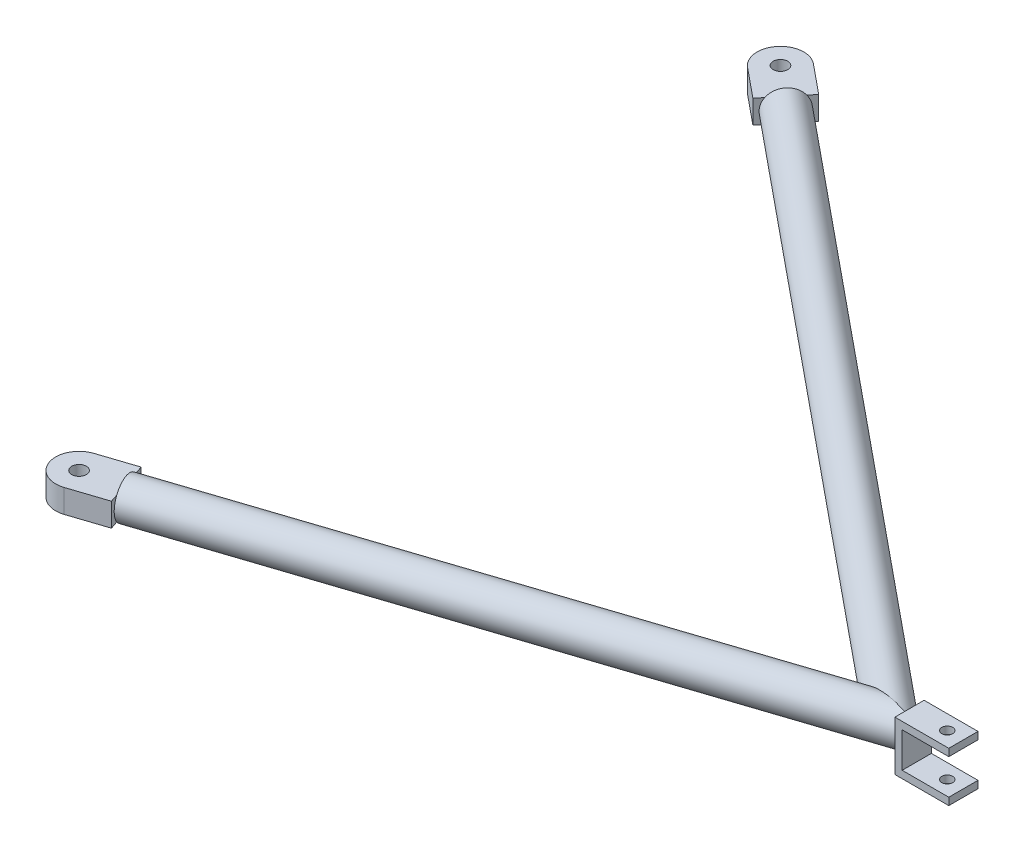
ISO-10303-21;
HEADER;
FILE_DESCRIPTION(('STEP AP214'),'2;1');
FILE_NAME('part.step','',(''),(''),'','','');
FILE_SCHEMA(('AUTOMOTIVE_DESIGN { 1 0 10303 214 1 1 1 1 }'));
ENDSEC;
DATA;
#1=APPLICATION_CONTEXT('core data for automotive mechanical design processes');
#2=APPLICATION_PROTOCOL_DEFINITION('international standard','automotive_design',2000,#1);
#3=PRODUCT_CONTEXT('',#1,'mechanical');
#4=PRODUCT('Part','Part','',(#3));
#5=PRODUCT_RELATED_PRODUCT_CATEGORY('part','',(#4));
#6=PRODUCT_DEFINITION_FORMATION('','',#4);
#7=PRODUCT_DEFINITION_CONTEXT('part definition',#1,'design');
#8=PRODUCT_DEFINITION('design','',#6,#7);
#9=PRODUCT_DEFINITION_SHAPE('','',#8);
#10=(LENGTH_UNIT() NAMED_UNIT(*) SI_UNIT(.MILLI.,.METRE.));
#11=(NAMED_UNIT(*) PLANE_ANGLE_UNIT() SI_UNIT($,.RADIAN.));
#12=(NAMED_UNIT(*) SI_UNIT($,.STERADIAN.) SOLID_ANGLE_UNIT());
#13=UNCERTAINTY_MEASURE_WITH_UNIT(LENGTH_MEASURE(1.E-05),#10,'distance_accuracy_value','');
#14=(GEOMETRIC_REPRESENTATION_CONTEXT(3) GLOBAL_UNCERTAINTY_ASSIGNED_CONTEXT((#13)) GLOBAL_UNIT_ASSIGNED_CONTEXT((#10,
#11,#12)) REPRESENTATION_CONTEXT('',''));
#15=CARTESIAN_POINT('',(0.,0.,0.));
#16=DIRECTION('',(0.,0.,1.));
#17=DIRECTION('',(1.,0.,0.));
#18=AXIS2_PLACEMENT_3D('',#15,#16,#17);
#19=CARTESIAN_POINT('',(12.8643448013669,0.,10.5323090755523));
#20=DIRECTION('',(-0.773752797618783,0.,-0.633487654320988));
#21=DIRECTION('',(-0.633487654320988,0.,0.773752797618783));
#22=AXIS2_PLACEMENT_3D('',#19,#20,#21);
#23=CYLINDRICAL_SURFACE('',#22,8.25499999999999);
#24=CARTESIAN_POINT('',(10.5039583333333,0.,8.59981113625265));
#25=DIRECTION('',(-1.,0.,0.));
#26=DIRECTION('',(0.,0.,-1.));
#27=AXIS2_PLACEMENT_3D('',#24,#25,#26);
#28=ELLIPSE('',#27,10.6687821037994,8.25499999999999);
#29=CARTESIAN_POINT('',(10.5039583333332,-6.45570290195814,1.9506643619853));
#30=VERTEX_POINT('',#29);
#31=CARTESIAN_POINT('',(10.5039583333332,6.45570290195814,1.9506643619853));
#32=VERTEX_POINT('',#31);
#33=EDGE_CURVE('E230',#30,#32,#28,.F.);
#34=ORIENTED_EDGE('',*,*,#33,.F.);
#35=CARTESIAN_POINT('',(0.,0.,0.));
#36=DIRECTION('',(0.182585791656968,0.,-0.983189925032289));
#37=DIRECTION('',(0.983189925032289,0.,0.182585791656968));
#38=AXIS2_PLACEMENT_3D('',#35,#36,#37);
#39=ELLIPSE('',#38,17.1421186326536,8.25499999999999);
#40=EDGE_CURVE('E55',#32,#30,#39,.F.);
#41=ORIENTED_EDGE('',*,*,#40,.F.);
#42=EDGE_LOOP('',(#34,#41));
#43=FACE_BOUND('',#42,.T.);
#44=CARTESIAN_POINT('',(-252.545175614795,0.,-206.764035493827));
#45=DIRECTION('',(-0.773752797618783,0.,-0.633487654320988));
#46=DIRECTION('',(-0.633487654320988,0.,0.773752797618783));
#47=AXIS2_PLACEMENT_3D('',#44,#45,#46);
#48=CIRCLE('',#47,8.25499999999999);
#49=CARTESIAN_POINT('',(-256.66716178576,5.08,-201.729370161716));
#50=VERTEX_POINT('',#49);
#51=CARTESIAN_POINT('',(-256.66716178576,-5.08,-201.729370161716));
#52=VERTEX_POINT('',#51);
#53=EDGE_CURVE('E41',#50,#52,#48,.F.);
#54=ORIENTED_EDGE('',*,*,#53,.T.);
#55=CARTESIAN_POINT('',(-252.545175614795,0.,-206.764035493827));
#56=DIRECTION('',(-0.773752797618783,0.,-0.633487654320988));
#57=DIRECTION('',(-0.633487654320988,0.,0.773752797618783));
#58=AXIS2_PLACEMENT_3D('',#55,#56,#57);
#59=CIRCLE('',#58,8.25499999999997);
#60=CARTESIAN_POINT('',(-248.423189443829,-5.08,-211.798700825939));
#61=VERTEX_POINT('',#60);
#62=EDGE_CURVE('E191',#52,#61,#59,.F.);
#63=ORIENTED_EDGE('',*,*,#62,.T.);
#64=CARTESIAN_POINT('',(-248.423189443829,5.08,-211.798700825939));
#65=VERTEX_POINT('',#64);
#66=EDGE_CURVE('E11',#61,#65,#48,.F.);
#67=ORIENTED_EDGE('',*,*,#66,.T.);
#68=CARTESIAN_POINT('',(-252.545175614795,0.,-206.764035493827));
#69=DIRECTION('',(-0.773752797618783,0.,-0.633487654320988));
#70=DIRECTION('',(-0.633487654320988,0.,0.773752797618783));
#71=AXIS2_PLACEMENT_3D('',#68,#69,#70);
#72=CIRCLE('',#71,8.25500000000001);
#73=EDGE_CURVE('E213',#65,#50,#72,.F.);
#74=ORIENTED_EDGE('',*,*,#73,.T.);
#75=EDGE_LOOP('',(#54,#63,#67,#74));
#76=FACE_BOUND('',#75,.T.);
#77=ADVANCED_FACE('F38',(#43,#76),#23,.T.);
#78=CARTESIAN_POINT('',(-265.319834303481,0.,87.5770833333333));
#79=DIRECTION('',(0.949605706168506,0.,-0.31344696969697));
#80=DIRECTION('',(-0.31344696969697,0.,-0.949605706168506));
#81=AXIS2_PLACEMENT_3D('',#78,#79,#80);
#82=CYLINDRICAL_SURFACE('',#81,8.25499999999999);
#83=CARTESIAN_POINT('',(10.5039583333332,0.,-3.46715893556594));
#84=DIRECTION('',(-1.,0.,0.));
#85=DIRECTION('',(0.,0.,-1.));
#86=AXIS2_PLACEMENT_3D('',#83,#84,#85);
#87=ELLIPSE('',#86,8.69308171420692,8.25499999999999);
#88=EDGE_CURVE('E52',#32,#30,#87,.F.);
#89=ORIENTED_EDGE('',*,*,#88,.F.);
#90=ORIENTED_EDGE('',*,*,#40,.T.);
#91=EDGE_LOOP('',(#89,#90));
#92=FACE_BOUND('',#91,.T.);
#93=CARTESIAN_POINT('',(-249.883043944005,0.,82.4816893939394));
#94=DIRECTION('',(-0.949605706168506,0.,0.313446969696969));
#95=DIRECTION('',(0.313446969696969,0.,0.949605706168506));
#96=AXIS2_PLACEMENT_3D('',#93,#94,#95);
#97=CIRCLE('',#96,8.25499999999999);
#98=CARTESIAN_POINT('',(-247.843502895953,5.08,88.6605968469856));
#99=VERTEX_POINT('',#98);
#100=CARTESIAN_POINT('',(-247.843502895953,-5.08,88.6605968469856));
#101=VERTEX_POINT('',#100);
#102=EDGE_CURVE('E218',#99,#101,#97,.F.);
#103=ORIENTED_EDGE('',*,*,#102,.T.);
#104=CARTESIAN_POINT('',(-249.883043944005,0.,82.4816893939394));
#105=DIRECTION('',(-0.949605706168506,0.,0.313446969696969));
#106=DIRECTION('',(0.313446969696969,0.,0.949605706168506));
#107=AXIS2_PLACEMENT_3D('',#104,#105,#106);
#108=CIRCLE('',#107,8.25499999999999);
#109=CARTESIAN_POINT('',(-251.922584992058,-5.08,76.3027819408932));
#110=VERTEX_POINT('',#109);
#111=EDGE_CURVE('E410',#101,#110,#108,.F.);
#112=ORIENTED_EDGE('',*,*,#111,.T.);
#113=CARTESIAN_POINT('',(-251.922584992058,5.08,76.3027819408932));
#114=VERTEX_POINT('',#113);
#115=EDGE_CURVE('E215',#110,#114,#97,.F.);
#116=ORIENTED_EDGE('',*,*,#115,.T.);
#117=CARTESIAN_POINT('',(-249.883043944005,0.,82.4816893939394));
#118=DIRECTION('',(-0.949605706168506,0.,0.313446969696969));
#119=DIRECTION('',(0.313446969696969,0.,0.949605706168506));
#120=AXIS2_PLACEMENT_3D('',#117,#118,#119);
#121=CIRCLE('',#120,8.25499999999998);
#122=EDGE_CURVE('E190',#114,#99,#121,.F.);
#123=ORIENTED_EDGE('',*,*,#122,.T.);
#124=EDGE_LOOP('',(#103,#112,#116,#123));
#125=FACE_BOUND('',#124,.T.);
#126=ADVANCED_FACE('F508',(#92,#125),#82,.T.);
#127=CARTESIAN_POINT('',(-253.067665156127,-5.08,72.8336954192674));
#128=DIRECTION('',(0.,-1.,0.));
#129=DIRECTION('',(0.,0.,-1.));
#130=AXIS2_PLACEMENT_3D('',#127,#128,#129);
#131=PLANE('',#130);
#132=CARTESIAN_POINT('',(-265.319834303481,-5.08,87.5770833333333));
#133=DIRECTION('',(0.,-1.,0.));
#134=DIRECTION('',(0.,0.,-1.));
#135=AXIS2_PLACEMENT_3D('',#132,#133,#134);
#136=CIRCLE('',#135,3.17499999999998);
#137=CARTESIAN_POINT('',(-265.319834303481,-5.08,84.4020833333334));
#138=VERTEX_POINT('',#137);
#139=EDGE_CURVE('E420',#138,#138,#136,.T.);
#140=ORIENTED_EDGE('',*,*,#139,.F.);
#141=EDGE_LOOP('',(#140));
#142=FACE_BOUND('',#141,.T.);
#143=DIRECTION('',(0.313446969696969,0.,0.949605706168506));
#144=VECTOR('',#143,1.);
#145=CARTESIAN_POINT('',(-247.843502895953,-5.08,88.6605968469856));
#146=LINE('',#145,#144);
#147=EDGE_CURVE('E406',#110,#101,#146,.T.);
#148=ORIENTED_EDGE('',*,*,#147,.T.);
#149=DIRECTION('',(0.313446969696969,0.,0.949605706168506));
#150=VECTOR('',#149,1.);
#151=CARTESIAN_POINT('',(-253.067665156127,-5.08,72.8336954192674));
#152=LINE('',#151,#150);
#153=CARTESIAN_POINT('',(-246.698422731884,-5.08,92.1296833686114));
#154=VERTEX_POINT('',#153);
#155=EDGE_CURVE('E341',#101,#154,#152,.T.);
#156=ORIENTED_EDGE('',*,*,#155,.T.);
#157=DIRECTION('',(-0.949605706168506,0.,0.31344696969697));
#158=VECTOR('',#157,1.);
#159=CARTESIAN_POINT('',(-246.698422731884,-5.08,92.1296833686114));
#160=LINE('',#159,#158);
#161=CARTESIAN_POINT('',(-262.135213091359,-5.08,97.2250773080053));
#162=VERTEX_POINT('',#161);
#163=EDGE_CURVE('E321',#154,#162,#160,.T.);
#164=ORIENTED_EDGE('',*,*,#163,.T.);
#165=CARTESIAN_POINT('',(-265.319834303481,-5.08,87.5770833333333));
#166=DIRECTION('',(0.,-1.,0.));
#167=DIRECTION('',(0.,0.,-1.));
#168=AXIS2_PLACEMENT_3D('',#165,#166,#167);
#169=CIRCLE('',#168,10.16);
#170=CARTESIAN_POINT('',(-268.504455515602,-5.08,77.9290893586613));
#171=VERTEX_POINT('',#170);
#172=EDGE_CURVE('E393',#171,#162,#169,.F.);
#173=ORIENTED_EDGE('',*,*,#172,.F.);
#174=DIRECTION('',(-0.949605706168506,0.,0.31344696969697));
#175=VECTOR('',#174,1.);
#176=CARTESIAN_POINT('',(-253.067665156127,-5.08,72.8336954192674));
#177=LINE('',#176,#175);
#178=CARTESIAN_POINT('',(-253.067665156127,-5.08,72.8336954192674));
#179=VERTEX_POINT('',#178);
#180=EDGE_CURVE('E331',#179,#171,#177,.T.);
#181=ORIENTED_EDGE('',*,*,#180,.F.);
#182=EDGE_CURVE('E327',#179,#110,#152,.T.);
#183=ORIENTED_EDGE('',*,*,#182,.T.);
#184=EDGE_LOOP('',(#148,#156,#164,#173,#181,#183));
#185=FACE_BOUND('',#184,.T.);
#186=ADVANCED_FACE('F513',(#142,#185),#131,.T.);
#187=CARTESIAN_POINT('',(-253.067665156127,5.08,72.8336954192674));
#188=DIRECTION('',(-0.31344696969697,0.,-0.949605706168506));
#189=DIRECTION('',(-0.949605706168506,0.,0.31344696969697));
#190=AXIS2_PLACEMENT_3D('',#187,#188,#189);
#191=PLANE('',#190);
#192=ORIENTED_EDGE('',*,*,#180,.T.);
#193=DIRECTION('',(0.,1.,0.));
#194=VECTOR('',#193,1.);
#195=CARTESIAN_POINT('',(-268.504455515602,-10.795,77.9290893586613));
#196=LINE('',#195,#194);
#197=CARTESIAN_POINT('',(-268.504455515602,5.08,77.9290893586613));
#198=VERTEX_POINT('',#197);
#199=EDGE_CURVE('E402',#171,#198,#196,.T.);
#200=ORIENTED_EDGE('',*,*,#199,.T.);
#201=DIRECTION('',(-0.949605706168506,0.,0.31344696969697));
#202=VECTOR('',#201,1.);
#203=CARTESIAN_POINT('',(-253.067665156127,5.08,72.8336954192674));
#204=LINE('',#203,#202);
#205=CARTESIAN_POINT('',(-253.067665156127,5.08,72.8336954192674));
#206=VERTEX_POINT('',#205);
#207=EDGE_CURVE('E326',#206,#198,#204,.T.);
#208=ORIENTED_EDGE('',*,*,#207,.F.);
#209=DIRECTION('',(0.,-1.,0.));
#210=VECTOR('',#209,1.);
#211=CARTESIAN_POINT('',(-253.067665156127,5.08,72.8336954192674));
#212=LINE('',#211,#210);
#213=EDGE_CURVE('E342',#206,#179,#212,.T.);
#214=ORIENTED_EDGE('',*,*,#213,.T.);
#215=EDGE_LOOP('',(#192,#200,#208,#214));
#216=FACE_BOUND('',#215,.T.);
#217=ADVANCED_FACE('F542',(#216),#191,.T.);
#218=CARTESIAN_POINT('',(-253.067665156127,5.08,72.8336954192674));
#219=DIRECTION('',(0.,1.,0.));
#220=DIRECTION('',(0.,0.,1.));
#221=AXIS2_PLACEMENT_3D('',#218,#219,#220);
#222=PLANE('',#221);
#223=CARTESIAN_POINT('',(-265.319834303481,5.08,87.5770833333333));
#224=DIRECTION('',(0.,1.,0.));
#225=DIRECTION('',(0.,0.,1.));
#226=AXIS2_PLACEMENT_3D('',#223,#224,#225);
#227=CIRCLE('',#226,3.17499999999998);
#228=CARTESIAN_POINT('',(-265.319834303481,5.08,90.7520833333333));
#229=VERTEX_POINT('',#228);
#230=EDGE_CURVE('E425',#229,#229,#227,.T.);
#231=ORIENTED_EDGE('',*,*,#230,.F.);
#232=EDGE_LOOP('',(#231));
#233=FACE_BOUND('',#232,.T.);
#234=DIRECTION('',(-0.313446969696969,0.,-0.949605706168506));
#235=VECTOR('',#234,1.);
#236=CARTESIAN_POINT('',(-251.922584992058,5.08,76.3027819408932));
#237=LINE('',#236,#235);
#238=EDGE_CURVE('E407',#99,#114,#237,.T.);
#239=ORIENTED_EDGE('',*,*,#238,.T.);
#240=DIRECTION('',(-0.313446969696969,0.,-0.949605706168506));
#241=VECTOR('',#240,1.);
#242=CARTESIAN_POINT('',(-253.067665156127,5.08,72.8336954192674));
#243=LINE('',#242,#241);
#244=EDGE_CURVE('E350',#114,#206,#243,.T.);
#245=ORIENTED_EDGE('',*,*,#244,.T.);
#246=ORIENTED_EDGE('',*,*,#207,.T.);
#247=CARTESIAN_POINT('',(-265.319834303481,5.08,87.5770833333333));
#248=DIRECTION('',(0.,-1.,0.));
#249=DIRECTION('',(0.,0.,-1.));
#250=AXIS2_PLACEMENT_3D('',#247,#248,#249);
#251=CIRCLE('',#250,10.16);
#252=CARTESIAN_POINT('',(-262.135213091359,5.08,97.2250773080053));
#253=VERTEX_POINT('',#252);
#254=EDGE_CURVE('E399',#253,#198,#251,.T.);
#255=ORIENTED_EDGE('',*,*,#254,.F.);
#256=DIRECTION('',(-0.949605706168506,0.,0.31344696969697));
#257=VECTOR('',#256,1.);
#258=CARTESIAN_POINT('',(-246.698422731884,5.08,92.1296833686114));
#259=LINE('',#258,#257);
#260=CARTESIAN_POINT('',(-246.698422731884,5.08,92.1296833686114));
#261=VERTEX_POINT('',#260);
#262=EDGE_CURVE('E322',#261,#253,#259,.T.);
#263=ORIENTED_EDGE('',*,*,#262,.F.);
#264=EDGE_CURVE('E346',#261,#99,#243,.T.);
#265=ORIENTED_EDGE('',*,*,#264,.T.);
#266=EDGE_LOOP('',(#239,#245,#246,#255,#263,#265));
#267=FACE_BOUND('',#266,.T.);
#268=ADVANCED_FACE('F538',(#233,#267),#222,.T.);
#269=CARTESIAN_POINT('',(-246.698422731884,5.08,92.1296833686114));
#270=DIRECTION('',(0.31344696969697,0.,0.949605706168506));
#271=DIRECTION('',(0.949605706168506,0.,-0.31344696969697));
#272=AXIS2_PLACEMENT_3D('',#269,#270,#271);
#273=PLANE('',#272);
#274=ORIENTED_EDGE('',*,*,#262,.T.);
#275=DIRECTION('',(0.,1.,0.));
#276=VECTOR('',#275,1.);
#277=CARTESIAN_POINT('',(-262.135213091359,-10.795,97.2250773080053));
#278=LINE('',#277,#276);
#279=EDGE_CURVE('E396',#162,#253,#278,.T.);
#280=ORIENTED_EDGE('',*,*,#279,.F.);
#281=ORIENTED_EDGE('',*,*,#163,.F.);
#282=DIRECTION('',(0.,1.,0.));
#283=VECTOR('',#282,1.);
#284=CARTESIAN_POINT('',(-246.698422731884,5.08,92.1296833686114));
#285=LINE('',#284,#283);
#286=EDGE_CURVE('E351',#154,#261,#285,.T.);
#287=ORIENTED_EDGE('',*,*,#286,.T.);
#288=EDGE_LOOP('',(#274,#280,#281,#287));
#289=FACE_BOUND('',#288,.T.);
#290=ADVANCED_FACE('F535',(#289),#273,.T.);
#291=CARTESIAN_POINT('',(-246.108941046893,-5.08,-214.625363917634));
#292=DIRECTION('',(0.,-1.,0.));
#293=DIRECTION('',(0.,0.,-1.));
#294=AXIS2_PLACEMENT_3D('',#291,#292,#293);
#295=PLANE('',#294);
#296=CARTESIAN_POINT('',(-265.319834303481,-5.08,-217.222916666667));
#297=DIRECTION('',(0.,-1.,0.));
#298=DIRECTION('',(0.,0.,-1.));
#299=AXIS2_PLACEMENT_3D('',#296,#297,#298);
#300=CIRCLE('',#299,3.17499999999998);
#301=CARTESIAN_POINT('',(-265.319834303481,-5.08,-220.397916666667));
#302=VERTEX_POINT('',#301);
#303=EDGE_CURVE('E429',#302,#302,#300,.T.);
#304=ORIENTED_EDGE('',*,*,#303,.F.);
#305=EDGE_LOOP('',(#304));
#306=FACE_BOUND('',#305,.T.);
#307=CARTESIAN_POINT('',(-265.319834303481,-5.08,-217.222916666667));
#308=DIRECTION('',(0.,-1.,0.));
#309=DIRECTION('',(0.,0.,-1.));
#310=AXIS2_PLACEMENT_3D('',#307,#308,#309);
#311=CIRCLE('',#310,10.1600000000001);
#312=CARTESIAN_POINT('',(-258.883599735579,-5.08,-225.084245090474));
#313=VERTEX_POINT('',#312);
#314=CARTESIAN_POINT('',(-271.756068871382,-5.08,-209.36158824286));
#315=VERTEX_POINT('',#314);
#316=EDGE_CURVE('E380',#313,#315,#311,.F.);
#317=ORIENTED_EDGE('',*,*,#316,.F.);
#318=DIRECTION('',(-0.773752797618782,0.,-0.633487654320988));
#319=VECTOR('',#318,1.);
#320=CARTESIAN_POINT('',(-246.108941046893,-5.08,-214.625363917634));
#321=LINE('',#320,#319);
#322=CARTESIAN_POINT('',(-246.108941046893,-5.08,-214.625363917634));
#323=VERTEX_POINT('',#322);
#324=EDGE_CURVE('E364',#323,#313,#321,.T.);
#325=ORIENTED_EDGE('',*,*,#324,.F.);
#326=DIRECTION('',(-0.633487654320988,0.,0.773752797618783));
#327=VECTOR('',#326,1.);
#328=CARTESIAN_POINT('',(-246.108941046893,-5.08,-214.625363917634));
#329=LINE('',#328,#327);
#330=EDGE_CURVE('E186',#323,#61,#329,.T.);
#331=ORIENTED_EDGE('',*,*,#330,.T.);
#332=DIRECTION('',(-0.633487654320988,0.,0.773752797618783));
#333=VECTOR('',#332,1.);
#334=CARTESIAN_POINT('',(-256.66716178576,-5.08,-201.729370161716));
#335=LINE('',#334,#333);
#336=EDGE_CURVE('E178',#61,#52,#335,.T.);
#337=ORIENTED_EDGE('',*,*,#336,.T.);
#338=CARTESIAN_POINT('',(-258.981410182696,-5.08,-198.90270707002));
#339=VERTEX_POINT('',#338);
#340=EDGE_CURVE('E183',#52,#339,#329,.T.);
#341=ORIENTED_EDGE('',*,*,#340,.T.);
#342=DIRECTION('',(-0.773752797618782,0.,-0.633487654320988));
#343=VECTOR('',#342,1.);
#344=CARTESIAN_POINT('',(-258.981410182696,-5.08,-198.90270707002));
#345=LINE('',#344,#343);
#346=EDGE_CURVE('E355',#339,#315,#345,.T.);
#347=ORIENTED_EDGE('',*,*,#346,.T.);
#348=EDGE_LOOP('',(#317,#325,#331,#337,#341,#347));
#349=FACE_BOUND('',#348,.T.);
#350=ADVANCED_FACE('F180',(#306,#349),#295,.T.);
#351=CARTESIAN_POINT('',(-246.108941046893,5.08,-214.625363917634));
#352=DIRECTION('',(0.633487654320988,0.,-0.773752797618782));
#353=DIRECTION('',(-0.773752797618782,0.,-0.633487654320988));
#354=AXIS2_PLACEMENT_3D('',#351,#352,#353);
#355=PLANE('',#354);
#356=ORIENTED_EDGE('',*,*,#324,.T.);
#357=DIRECTION('',(0.,1.,0.));
#358=VECTOR('',#357,1.);
#359=CARTESIAN_POINT('',(-258.883599735579,-10.795,-225.084245090474));
#360=LINE('',#359,#358);
#361=CARTESIAN_POINT('',(-258.883599735579,5.08,-225.084245090474));
#362=VERTEX_POINT('',#361);
#363=EDGE_CURVE('E389',#313,#362,#360,.T.);
#364=ORIENTED_EDGE('',*,*,#363,.T.);
#365=DIRECTION('',(-0.773752797618782,0.,-0.633487654320988));
#366=VECTOR('',#365,1.);
#367=CARTESIAN_POINT('',(-246.108941046893,5.08,-214.625363917634));
#368=LINE('',#367,#366);
#369=CARTESIAN_POINT('',(-246.108941046893,5.08,-214.625363917634));
#370=VERTEX_POINT('',#369);
#371=EDGE_CURVE('E360',#370,#362,#368,.T.);
#372=ORIENTED_EDGE('',*,*,#371,.F.);
#373=DIRECTION('',(0.,-1.,0.));
#374=VECTOR('',#373,1.);
#375=CARTESIAN_POINT('',(-246.108941046893,5.08,-214.625363917634));
#376=LINE('',#375,#374);
#377=EDGE_CURVE('E209',#370,#323,#376,.T.);
#378=ORIENTED_EDGE('',*,*,#377,.T.);
#379=EDGE_LOOP('',(#356,#364,#372,#378));
#380=FACE_BOUND('',#379,.T.);
#381=ADVANCED_FACE('F557',(#380),#355,.T.);
#382=CARTESIAN_POINT('',(-246.108941046893,5.08,-214.625363917634));
#383=DIRECTION('',(0.,1.,0.));
#384=DIRECTION('',(0.,0.,1.));
#385=AXIS2_PLACEMENT_3D('',#382,#383,#384);
#386=PLANE('',#385);
#387=CARTESIAN_POINT('',(-265.319834303481,5.08,-217.222916666667));
#388=DIRECTION('',(0.,1.,0.));
#389=DIRECTION('',(0.,0.,1.));
#390=AXIS2_PLACEMENT_3D('',#387,#388,#389);
#391=CIRCLE('',#390,3.17499999999998);
#392=CARTESIAN_POINT('',(-265.319834303481,5.08,-214.047916666667));
#393=VERTEX_POINT('',#392);
#394=EDGE_CURVE('E433',#393,#393,#391,.T.);
#395=ORIENTED_EDGE('',*,*,#394,.F.);
#396=EDGE_LOOP('',(#395));
#397=FACE_BOUND('',#396,.T.);
#398=ORIENTED_EDGE('',*,*,#371,.T.);
#399=CARTESIAN_POINT('',(-265.319834303481,5.08,-217.222916666667));
#400=DIRECTION('',(0.,-1.,0.));
#401=DIRECTION('',(0.,0.,1.));
#402=AXIS2_PLACEMENT_3D('',#399,#400,#401);
#403=CIRCLE('',#402,10.1600000000001);
#404=CARTESIAN_POINT('',(-271.756068871382,5.08,-209.36158824286));
#405=VERTEX_POINT('',#404);
#406=EDGE_CURVE('E386',#405,#362,#403,.T.);
#407=ORIENTED_EDGE('',*,*,#406,.F.);
#408=DIRECTION('',(-0.773752797618782,0.,-0.633487654320988));
#409=VECTOR('',#408,1.);
#410=CARTESIAN_POINT('',(-258.981410182696,5.08,-198.90270707002));
#411=LINE('',#410,#409);
#412=CARTESIAN_POINT('',(-258.981410182696,5.08,-198.90270707002));
#413=VERTEX_POINT('',#412);
#414=EDGE_CURVE('E356',#413,#405,#411,.T.);
#415=ORIENTED_EDGE('',*,*,#414,.F.);
#416=DIRECTION('',(0.633487654320988,0.,-0.773752797618783));
#417=VECTOR('',#416,1.);
#418=CARTESIAN_POINT('',(-246.108941046893,5.08,-214.625363917634));
#419=LINE('',#418,#417);
#420=EDGE_CURVE('E374',#413,#50,#419,.T.);
#421=ORIENTED_EDGE('',*,*,#420,.T.);
#422=DIRECTION('',(0.633487654320988,0.,-0.773752797618783));
#423=VECTOR('',#422,1.);
#424=CARTESIAN_POINT('',(-248.423189443829,5.08,-211.798700825939));
#425=LINE('',#424,#423);
#426=EDGE_CURVE('E198',#50,#65,#425,.T.);
#427=ORIENTED_EDGE('',*,*,#426,.T.);
#428=EDGE_CURVE('E377',#65,#370,#419,.T.);
#429=ORIENTED_EDGE('',*,*,#428,.T.);
#430=EDGE_LOOP('',(#398,#407,#415,#421,#427,#429));
#431=FACE_BOUND('',#430,.T.);
#432=ADVANCED_FACE('F504',(#397,#431),#386,.T.);
#433=CARTESIAN_POINT('',(-258.981410182696,5.08,-198.90270707002));
#434=DIRECTION('',(-0.633487654320988,0.,0.773752797618782));
#435=DIRECTION('',(0.773752797618782,0.,0.633487654320988));
#436=AXIS2_PLACEMENT_3D('',#433,#434,#435);
#437=PLANE('',#436);
#438=ORIENTED_EDGE('',*,*,#414,.T.);
#439=DIRECTION('',(0.,1.,0.));
#440=VECTOR('',#439,1.);
#441=CARTESIAN_POINT('',(-271.756068871382,-10.795,-209.36158824286));
#442=LINE('',#441,#440);
#443=EDGE_CURVE('E383',#315,#405,#442,.T.);
#444=ORIENTED_EDGE('',*,*,#443,.F.);
#445=ORIENTED_EDGE('',*,*,#346,.F.);
#446=DIRECTION('',(0.,1.,0.));
#447=VECTOR('',#446,1.);
#448=CARTESIAN_POINT('',(-258.981410182696,5.08,-198.90270707002));
#449=LINE('',#448,#447);
#450=EDGE_CURVE('E207',#339,#413,#449,.T.);
#451=ORIENTED_EDGE('',*,*,#450,.T.);
#452=EDGE_LOOP('',(#438,#444,#445,#451));
#453=FACE_BOUND('',#452,.T.);
#454=ADVANCED_FACE('F496',(#453),#437,.T.);
#455=CARTESIAN_POINT('',(33.9317533676103,7.62,-3.81));
#456=DIRECTION('',(1.,0.,0.));
#457=DIRECTION('',(0.,0.,-1.));
#458=AXIS2_PLACEMENT_3D('',#455,#456,#457);
#459=PLANE('',#458);
#460=DIRECTION('',(0.,0.,1.));
#461=VECTOR('',#460,1.);
#462=CARTESIAN_POINT('',(33.9317533676103,10.795,-3.81));
#463=LINE('',#462,#461);
#464=CARTESIAN_POINT('',(33.9317533676103,10.795,-3.81));
#465=VERTEX_POINT('',#464);
#466=CARTESIAN_POINT('',(33.9317533676103,10.795,8.89));
#467=VERTEX_POINT('',#466);
#468=EDGE_CURVE('E235',#465,#467,#463,.T.);
#469=ORIENTED_EDGE('',*,*,#468,.T.);
#470=DIRECTION('',(0.,1.,0.));
#471=VECTOR('',#470,1.);
#472=CARTESIAN_POINT('',(33.9317533676103,7.62,8.89));
#473=LINE('',#472,#471);
#474=CARTESIAN_POINT('',(33.9317533676103,7.62,8.89));
#475=VERTEX_POINT('',#474);
#476=EDGE_CURVE('E317',#475,#467,#473,.T.);
#477=ORIENTED_EDGE('',*,*,#476,.F.);
#478=DIRECTION('',(0.,0.,1.));
#479=VECTOR('',#478,1.);
#480=CARTESIAN_POINT('',(33.9317533676103,7.62,-3.81));
#481=LINE('',#480,#479);
#482=CARTESIAN_POINT('',(33.9317533676103,7.62,-3.81));
#483=VERTEX_POINT('',#482);
#484=EDGE_CURVE('E234',#483,#475,#481,.T.);
#485=ORIENTED_EDGE('',*,*,#484,.F.);
#486=DIRECTION('',(0.,1.,0.));
#487=VECTOR('',#486,1.);
#488=CARTESIAN_POINT('',(33.9317533676103,7.62,-3.81));
#489=LINE('',#488,#487);
#490=EDGE_CURVE('E286',#483,#465,#489,.T.);
#491=ORIENTED_EDGE('',*,*,#490,.T.);
#492=EDGE_LOOP('',(#469,#477,#485,#491));
#493=FACE_BOUND('',#492,.T.);
#494=ADVANCED_FACE('F494',(#493),#459,.T.);
#495=CARTESIAN_POINT('',(13.6789583333333,7.62,-3.81));
#496=DIRECTION('',(0.,-1.,0.));
#497=DIRECTION('',(1.,0.,0.));
#498=AXIS2_PLACEMENT_3D('',#495,#496,#497);
#499=PLANE('',#498);
#500=CARTESIAN_POINT('',(26.9334887853007,7.62,2.54));
#501=DIRECTION('',(0.,-1.,0.));
#502=DIRECTION('',(1.,0.,0.));
#503=AXIS2_PLACEMENT_3D('',#500,#501,#502);
#504=CIRCLE('',#503,2.38124999999999);
#505=CARTESIAN_POINT('',(29.3147387853007,7.62,2.54));
#506=VERTEX_POINT('',#505);
#507=EDGE_CURVE('E437',#506,#506,#504,.T.);
#508=ORIENTED_EDGE('',*,*,#507,.F.);
#509=EDGE_LOOP('',(#508));
#510=FACE_BOUND('',#509,.T.);
#511=ORIENTED_EDGE('',*,*,#484,.T.);
#512=DIRECTION('',(1.,0.,0.));
#513=VECTOR('',#512,1.);
#514=CARTESIAN_POINT('',(13.6789583333333,7.62,8.89));
#515=LINE('',#514,#513);
#516=CARTESIAN_POINT('',(13.6789583333333,7.62,8.89));
#517=VERTEX_POINT('',#516);
#518=EDGE_CURVE('E290',#517,#475,#515,.T.);
#519=ORIENTED_EDGE('',*,*,#518,.F.);
#520=DIRECTION('',(0.,0.,1.));
#521=VECTOR('',#520,1.);
#522=CARTESIAN_POINT('',(13.6789583333333,7.62,-3.81));
#523=LINE('',#522,#521);
#524=CARTESIAN_POINT('',(13.6789583333333,7.62,-3.81));
#525=VERTEX_POINT('',#524);
#526=EDGE_CURVE('E254',#525,#517,#523,.T.);
#527=ORIENTED_EDGE('',*,*,#526,.F.);
#528=DIRECTION('',(1.,0.,0.));
#529=VECTOR('',#528,1.);
#530=CARTESIAN_POINT('',(13.6789583333333,7.62,-3.81));
#531=LINE('',#530,#529);
#532=EDGE_CURVE('E239',#525,#483,#531,.T.);
#533=ORIENTED_EDGE('',*,*,#532,.T.);
#534=EDGE_LOOP('',(#511,#519,#527,#533));
#535=FACE_BOUND('',#534,.T.);
#536=ADVANCED_FACE('F491',(#510,#535),#499,.T.);
#537=CARTESIAN_POINT('',(13.6789583333333,-7.62,-3.81));
#538=DIRECTION('',(1.,0.,0.));
#539=DIRECTION('',(0.,1.,0.));
#540=AXIS2_PLACEMENT_3D('',#537,#538,#539);
#541=PLANE('',#540);
#542=ORIENTED_EDGE('',*,*,#526,.T.);
#543=DIRECTION('',(0.,1.,0.));
#544=VECTOR('',#543,1.);
#545=CARTESIAN_POINT('',(13.6789583333333,-7.62,8.89));
#546=LINE('',#545,#544);
#547=CARTESIAN_POINT('',(13.6789583333333,-7.62,8.89));
#548=VERTEX_POINT('',#547);
#549=EDGE_CURVE('E294',#548,#517,#546,.T.);
#550=ORIENTED_EDGE('',*,*,#549,.F.);
#551=DIRECTION('',(0.,0.,1.));
#552=VECTOR('',#551,1.);
#553=CARTESIAN_POINT('',(13.6789583333333,-7.62,-3.81));
#554=LINE('',#553,#552);
#555=CARTESIAN_POINT('',(13.6789583333333,-7.62,-3.81));
#556=VERTEX_POINT('',#555);
#557=EDGE_CURVE('E251',#556,#548,#554,.T.);
#558=ORIENTED_EDGE('',*,*,#557,.F.);
#559=DIRECTION('',(0.,1.,0.));
#560=VECTOR('',#559,1.);
#561=CARTESIAN_POINT('',(13.6789583333333,-7.62,-3.81));
#562=LINE('',#561,#560);
#563=EDGE_CURVE('E263',#556,#525,#562,.T.);
#564=ORIENTED_EDGE('',*,*,#563,.T.);
#565=EDGE_LOOP('',(#542,#550,#558,#564));
#566=FACE_BOUND('',#565,.T.);
#567=ADVANCED_FACE('F487',(#566),#541,.T.);
#568=CARTESIAN_POINT('',(33.9317533676103,-7.62,-3.81));
#569=DIRECTION('',(0.,1.,0.));
#570=DIRECTION('',(-1.,0.,0.));
#571=AXIS2_PLACEMENT_3D('',#568,#569,#570);
#572=PLANE('',#571);
#573=CARTESIAN_POINT('',(26.9334887853007,-7.62,2.54));
#574=DIRECTION('',(0.,1.,0.));
#575=DIRECTION('',(-1.,0.,0.));
#576=AXIS2_PLACEMENT_3D('',#573,#574,#575);
#577=CIRCLE('',#576,2.38124999999999);
#578=CARTESIAN_POINT('',(24.5522387853007,-7.62,2.54));
#579=VERTEX_POINT('',#578);
#580=EDGE_CURVE('E441',#579,#579,#577,.T.);
#581=ORIENTED_EDGE('',*,*,#580,.F.);
#582=EDGE_LOOP('',(#581));
#583=FACE_BOUND('',#582,.T.);
#584=ORIENTED_EDGE('',*,*,#557,.T.);
#585=DIRECTION('',(-1.,0.,0.));
#586=VECTOR('',#585,1.);
#587=CARTESIAN_POINT('',(33.9317533676103,-7.62,8.89));
#588=LINE('',#587,#586);
#589=CARTESIAN_POINT('',(33.9317533676103,-7.62,8.89));
#590=VERTEX_POINT('',#589);
#591=EDGE_CURVE('E297',#590,#548,#588,.T.);
#592=ORIENTED_EDGE('',*,*,#591,.F.);
#593=DIRECTION('',(0.,0.,1.));
#594=VECTOR('',#593,1.);
#595=CARTESIAN_POINT('',(33.9317533676103,-7.62,-3.81));
#596=LINE('',#595,#594);
#597=CARTESIAN_POINT('',(33.9317533676103,-7.62,-3.81));
#598=VERTEX_POINT('',#597);
#599=EDGE_CURVE('E248',#598,#590,#596,.T.);
#600=ORIENTED_EDGE('',*,*,#599,.F.);
#601=DIRECTION('',(-1.,0.,0.));
#602=VECTOR('',#601,1.);
#603=CARTESIAN_POINT('',(33.9317533676103,-7.62,-3.81));
#604=LINE('',#603,#602);
#605=EDGE_CURVE('E266',#598,#556,#604,.T.);
#606=ORIENTED_EDGE('',*,*,#605,.T.);
#607=EDGE_LOOP('',(#584,#592,#600,#606));
#608=FACE_BOUND('',#607,.T.);
#609=ADVANCED_FACE('F485',(#583,#608),#572,.T.);
#610=CARTESIAN_POINT('',(33.9317533676103,-10.795,-3.81));
#611=DIRECTION('',(1.,0.,0.));
#612=DIRECTION('',(0.,0.,-1.));
#613=AXIS2_PLACEMENT_3D('',#610,#611,#612);
#614=PLANE('',#613);
#615=ORIENTED_EDGE('',*,*,#599,.T.);
#616=DIRECTION('',(0.,1.,0.));
#617=VECTOR('',#616,1.);
#618=CARTESIAN_POINT('',(33.9317533676103,-10.795,8.89));
#619=LINE('',#618,#617);
#620=CARTESIAN_POINT('',(33.9317533676103,-10.795,8.89));
#621=VERTEX_POINT('',#620);
#622=EDGE_CURVE('E301',#621,#590,#619,.T.);
#623=ORIENTED_EDGE('',*,*,#622,.F.);
#624=DIRECTION('',(0.,0.,1.));
#625=VECTOR('',#624,1.);
#626=CARTESIAN_POINT('',(33.9317533676103,-10.795,-3.81));
#627=LINE('',#626,#625);
#628=CARTESIAN_POINT('',(33.9317533676103,-10.795,-3.81));
#629=VERTEX_POINT('',#628);
#630=EDGE_CURVE('E245',#629,#621,#627,.T.);
#631=ORIENTED_EDGE('',*,*,#630,.F.);
#632=DIRECTION('',(0.,1.,0.));
#633=VECTOR('',#632,1.);
#634=CARTESIAN_POINT('',(33.9317533676103,-10.795,-3.81));
#635=LINE('',#634,#633);
#636=EDGE_CURVE('E270',#629,#598,#635,.T.);
#637=ORIENTED_EDGE('',*,*,#636,.T.);
#638=EDGE_LOOP('',(#615,#623,#631,#637));
#639=FACE_BOUND('',#638,.T.);
#640=ADVANCED_FACE('F480',(#639),#614,.T.);
#641=CARTESIAN_POINT('',(10.5039583333333,-10.795,-3.81));
#642=DIRECTION('',(0.,-1.,0.));
#643=DIRECTION('',(0.,0.,-1.));
#644=AXIS2_PLACEMENT_3D('',#641,#642,#643);
#645=PLANE('',#644);
#646=CARTESIAN_POINT('',(26.9334887853007,-10.795,2.54));
#647=DIRECTION('',(0.,1.,0.));
#648=DIRECTION('',(0.,0.,1.));
#649=AXIS2_PLACEMENT_3D('',#646,#647,#648);
#650=CIRCLE('',#649,2.38124999999998);
#651=CARTESIAN_POINT('',(26.9334887853007,-10.795,4.92124999999998));
#652=VERTEX_POINT('',#651);
#653=EDGE_CURVE('E445',#652,#652,#650,.T.);
#654=ORIENTED_EDGE('',*,*,#653,.T.);
#655=EDGE_LOOP('',(#654));
#656=FACE_BOUND('',#655,.T.);
#657=ORIENTED_EDGE('',*,*,#630,.T.);
#658=DIRECTION('',(1.,0.,0.));
#659=VECTOR('',#658,1.);
#660=CARTESIAN_POINT('',(10.5039583333333,-10.795,8.89));
#661=LINE('',#660,#659);
#662=CARTESIAN_POINT('',(10.5039583333333,-10.795,8.89));
#663=VERTEX_POINT('',#662);
#664=EDGE_CURVE('E305',#663,#621,#661,.T.);
#665=ORIENTED_EDGE('',*,*,#664,.F.);
#666=DIRECTION('',(0.,0.,1.));
#667=VECTOR('',#666,1.);
#668=CARTESIAN_POINT('',(10.5039583333333,-10.795,-3.81));
#669=LINE('',#668,#667);
#670=CARTESIAN_POINT('',(10.5039583333333,-10.795,-3.81));
#671=VERTEX_POINT('',#670);
#672=EDGE_CURVE('E242',#671,#663,#669,.T.);
#673=ORIENTED_EDGE('',*,*,#672,.F.);
#674=DIRECTION('',(1.,0.,0.));
#675=VECTOR('',#674,1.);
#676=CARTESIAN_POINT('',(10.5039583333333,-10.795,-3.81));
#677=LINE('',#676,#675);
#678=EDGE_CURVE('E274',#671,#629,#677,.T.);
#679=ORIENTED_EDGE('',*,*,#678,.T.);
#680=EDGE_LOOP('',(#657,#665,#673,#679));
#681=FACE_BOUND('',#680,.T.);
#682=ADVANCED_FACE('F473',(#656,#681),#645,.T.);
#683=CARTESIAN_POINT('',(10.5039583333333,10.795,-3.81));
#684=DIRECTION('',(-1.,0.,0.));
#685=DIRECTION('',(0.,-1.,0.));
#686=AXIS2_PLACEMENT_3D('',#683,#684,#685);
#687=PLANE('',#686);
#688=ORIENTED_EDGE('',*,*,#88,.T.);
#689=ORIENTED_EDGE('',*,*,#33,.T.);
#690=EDGE_LOOP('',(#688,#689));
#691=FACE_BOUND('',#690,.T.);
#692=ORIENTED_EDGE('',*,*,#672,.T.);
#693=DIRECTION('',(0.,-1.,0.));
#694=VECTOR('',#693,1.);
#695=CARTESIAN_POINT('',(10.5039583333333,10.795,8.89));
#696=LINE('',#695,#694);
#697=CARTESIAN_POINT('',(10.5039583333333,10.795,8.89));
#698=VERTEX_POINT('',#697);
#699=EDGE_CURVE('E309',#698,#663,#696,.T.);
#700=ORIENTED_EDGE('',*,*,#699,.F.);
#701=DIRECTION('',(0.,0.,1.));
#702=VECTOR('',#701,1.);
#703=CARTESIAN_POINT('',(10.5039583333333,10.795,-3.81));
#704=LINE('',#703,#702);
#705=CARTESIAN_POINT('',(10.5039583333333,10.795,-3.81));
#706=VERTEX_POINT('',#705);
#707=EDGE_CURVE('E238',#706,#698,#704,.T.);
#708=ORIENTED_EDGE('',*,*,#707,.F.);
#709=DIRECTION('',(0.,-1.,0.));
#710=VECTOR('',#709,1.);
#711=CARTESIAN_POINT('',(10.5039583333333,10.795,-3.81));
#712=LINE('',#711,#710);
#713=EDGE_CURVE('E278',#706,#671,#712,.T.);
#714=ORIENTED_EDGE('',*,*,#713,.T.);
#715=EDGE_LOOP('',(#692,#700,#708,#714));
#716=FACE_BOUND('',#715,.T.);
#717=ADVANCED_FACE('F460',(#691,#716),#687,.T.);
#718=CARTESIAN_POINT('',(33.9317533676103,10.795,-3.81));
#719=DIRECTION('',(0.,1.,0.));
#720=DIRECTION('',(-1.,0.,0.));
#721=AXIS2_PLACEMENT_3D('',#718,#719,#720);
#722=PLANE('',#721);
#723=CARTESIAN_POINT('',(26.9334887853007,10.795,2.54));
#724=DIRECTION('',(0.,1.,0.));
#725=DIRECTION('',(0.,0.,1.));
#726=AXIS2_PLACEMENT_3D('',#723,#724,#725);
#727=CIRCLE('',#726,2.38124999999999);
#728=CARTESIAN_POINT('',(26.9334887853007,10.795,4.92124999999999));
#729=VERTEX_POINT('',#728);
#730=EDGE_CURVE('E449',#729,#729,#727,.T.);
#731=ORIENTED_EDGE('',*,*,#730,.F.);
#732=EDGE_LOOP('',(#731));
#733=FACE_BOUND('',#732,.T.);
#734=ORIENTED_EDGE('',*,*,#707,.T.);
#735=DIRECTION('',(-1.,0.,0.));
#736=VECTOR('',#735,1.);
#737=CARTESIAN_POINT('',(33.9317533676103,10.795,8.89));
#738=LINE('',#737,#736);
#739=EDGE_CURVE('E313',#467,#698,#738,.T.);
#740=ORIENTED_EDGE('',*,*,#739,.F.);
#741=ORIENTED_EDGE('',*,*,#468,.F.);
#742=DIRECTION('',(-1.,0.,0.));
#743=VECTOR('',#742,1.);
#744=CARTESIAN_POINT('',(33.9317533676103,10.795,-3.81));
#745=LINE('',#744,#743);
#746=EDGE_CURVE('E282',#465,#706,#745,.T.);
#747=ORIENTED_EDGE('',*,*,#746,.T.);
#748=EDGE_LOOP('',(#734,#740,#741,#747));
#749=FACE_BOUND('',#748,.T.);
#750=ADVANCED_FACE('F456',(#733,#749),#722,.T.);
#751=CARTESIAN_POINT('',(0.,0.,-3.81));
#752=DIRECTION('',(0.,0.,1.));
#753=DIRECTION('',(1.,0.,0.));
#754=AXIS2_PLACEMENT_3D('',#751,#752,#753);
#755=PLANE('',#754);
#756=ORIENTED_EDGE('',*,*,#490,.F.);
#757=ORIENTED_EDGE('',*,*,#532,.F.);
#758=ORIENTED_EDGE('',*,*,#563,.F.);
#759=ORIENTED_EDGE('',*,*,#605,.F.);
#760=ORIENTED_EDGE('',*,*,#636,.F.);
#761=ORIENTED_EDGE('',*,*,#678,.F.);
#762=ORIENTED_EDGE('',*,*,#713,.F.);
#763=ORIENTED_EDGE('',*,*,#746,.F.);
#764=EDGE_LOOP('',(#756,#757,#758,#759,#760,#761,#762,#763));
#765=FACE_BOUND('',#764,.T.);
#766=ADVANCED_FACE('F459',(#765),#755,.F.);
#767=CARTESIAN_POINT('',(0.,0.,8.89));
#768=DIRECTION('',(0.,0.,1.));
#769=DIRECTION('',(1.,0.,0.));
#770=AXIS2_PLACEMENT_3D('',#767,#768,#769);
#771=PLANE('',#770);
#772=ORIENTED_EDGE('',*,*,#476,.T.);
#773=ORIENTED_EDGE('',*,*,#739,.T.);
#774=ORIENTED_EDGE('',*,*,#699,.T.);
#775=ORIENTED_EDGE('',*,*,#664,.T.);
#776=ORIENTED_EDGE('',*,*,#622,.T.);
#777=ORIENTED_EDGE('',*,*,#591,.T.);
#778=ORIENTED_EDGE('',*,*,#549,.T.);
#779=ORIENTED_EDGE('',*,*,#518,.T.);
#780=EDGE_LOOP('',(#772,#773,#774,#775,#776,#777,#778,#779));
#781=FACE_BOUND('',#780,.T.);
#782=ADVANCED_FACE('F468',(#781),#771,.T.);
#783=CARTESIAN_POINT('',(-249.883043944005,0.,82.4816893939393));
#784=DIRECTION('',(-0.949605706168506,0.,0.313446969696969));
#785=DIRECTION('',(0.313446969696969,0.,0.949605706168506));
#786=AXIS2_PLACEMENT_3D('',#783,#784,#785);
#787=PLANE('',#786);
#788=ORIENTED_EDGE('',*,*,#115,.F.);
#789=ORIENTED_EDGE('',*,*,#182,.F.);
#790=ORIENTED_EDGE('',*,*,#213,.F.);
#791=ORIENTED_EDGE('',*,*,#244,.F.);
#792=EDGE_LOOP('',(#788,#789,#790,#791));
#793=FACE_BOUND('',#792,.T.);
#794=ADVANCED_FACE('F534',(#793),#787,.F.);
#795=ORIENTED_EDGE('',*,*,#102,.F.);
#796=ORIENTED_EDGE('',*,*,#264,.F.);
#797=ORIENTED_EDGE('',*,*,#286,.F.);
#798=ORIENTED_EDGE('',*,*,#155,.F.);
#799=EDGE_LOOP('',(#795,#796,#797,#798));
#800=FACE_BOUND('',#799,.T.);
#801=ADVANCED_FACE('F550',(#800),#787,.F.);
#802=CARTESIAN_POINT('',(-252.545175614795,0.,-206.764035493827));
#803=DIRECTION('',(-0.773752797618783,0.,-0.633487654320988));
#804=DIRECTION('',(-0.633487654320988,0.,0.773752797618783));
#805=AXIS2_PLACEMENT_3D('',#802,#803,#804);
#806=PLANE('',#805);
#807=ORIENTED_EDGE('',*,*,#66,.F.);
#808=ORIENTED_EDGE('',*,*,#330,.F.);
#809=ORIENTED_EDGE('',*,*,#377,.F.);
#810=ORIENTED_EDGE('',*,*,#428,.F.);
#811=EDGE_LOOP('',(#807,#808,#809,#810));
#812=FACE_BOUND('',#811,.T.);
#813=ADVANCED_FACE('F552',(#812),#806,.F.);
#814=ORIENTED_EDGE('',*,*,#53,.F.);
#815=ORIENTED_EDGE('',*,*,#420,.F.);
#816=ORIENTED_EDGE('',*,*,#450,.F.);
#817=ORIENTED_EDGE('',*,*,#340,.F.);
#818=EDGE_LOOP('',(#814,#815,#816,#817));
#819=FACE_BOUND('',#818,.T.);
#820=ADVANCED_FACE('F203',(#819),#806,.F.);
#821=CARTESIAN_POINT('',(-265.319834303481,-10.795,-217.222916666667));
#822=DIRECTION('',(0.,1.,0.));
#823=DIRECTION('',(0.,0.,1.));
#824=AXIS2_PLACEMENT_3D('',#821,#822,#823);
#825=CYLINDRICAL_SURFACE('',#824,10.1600000000001);
#826=ORIENTED_EDGE('',*,*,#316,.T.);
#827=ORIENTED_EDGE('',*,*,#443,.T.);
#828=ORIENTED_EDGE('',*,*,#406,.T.);
#829=ORIENTED_EDGE('',*,*,#363,.F.);
#830=EDGE_LOOP('',(#826,#827,#828,#829));
#831=FACE_BOUND('',#830,.T.);
#832=ADVANCED_FACE('F567',(#831),#825,.T.);
#833=CARTESIAN_POINT('',(-265.319834303481,-10.795,87.5770833333333));
#834=DIRECTION('',(0.,1.,0.));
#835=DIRECTION('',(0.,0.,1.));
#836=AXIS2_PLACEMENT_3D('',#833,#834,#835);
#837=CYLINDRICAL_SURFACE('',#836,10.16);
#838=ORIENTED_EDGE('',*,*,#172,.T.);
#839=ORIENTED_EDGE('',*,*,#279,.T.);
#840=ORIENTED_EDGE('',*,*,#254,.T.);
#841=ORIENTED_EDGE('',*,*,#199,.F.);
#842=EDGE_LOOP('',(#838,#839,#840,#841));
#843=FACE_BOUND('',#842,.T.);
#844=ADVANCED_FACE('F570',(#843),#837,.T.);
#845=CARTESIAN_POINT('',(-249.883043944005,0.,82.4816893939393));
#846=DIRECTION('',(-0.949605706168506,0.,0.313446969696969));
#847=DIRECTION('',(0.313446969696969,0.,0.949605706168506));
#848=AXIS2_PLACEMENT_3D('',#845,#846,#847);
#849=PLANE('',#848);
#850=ORIENTED_EDGE('',*,*,#122,.F.);
#851=ORIENTED_EDGE('',*,*,#238,.F.);
#852=EDGE_LOOP('',(#850,#851));
#853=FACE_BOUND('',#852,.T.);
#854=ADVANCED_FACE('F574',(#853),#849,.T.);
#855=CARTESIAN_POINT('',(-249.883043944005,0.,82.4816893939393));
#856=DIRECTION('',(-0.949605706168506,0.,0.313446969696969));
#857=DIRECTION('',(0.313446969696969,0.,0.949605706168506));
#858=AXIS2_PLACEMENT_3D('',#855,#856,#857);
#859=PLANE('',#858);
#860=ORIENTED_EDGE('',*,*,#111,.F.);
#861=ORIENTED_EDGE('',*,*,#147,.F.);
#862=EDGE_LOOP('',(#860,#861));
#863=FACE_BOUND('',#862,.T.);
#864=ADVANCED_FACE('F578',(#863),#859,.T.);
#865=CARTESIAN_POINT('',(-252.545175614795,0.,-206.764035493827));
#866=DIRECTION('',(-0.773752797618783,0.,-0.633487654320988));
#867=DIRECTION('',(-0.633487654320988,0.,0.773752797618783));
#868=AXIS2_PLACEMENT_3D('',#865,#866,#867);
#869=PLANE('',#868);
#870=ORIENTED_EDGE('',*,*,#73,.F.);
#871=ORIENTED_EDGE('',*,*,#426,.F.);
#872=EDGE_LOOP('',(#870,#871));
#873=FACE_BOUND('',#872,.T.);
#874=ADVANCED_FACE('F582',(#873),#869,.T.);
#875=CARTESIAN_POINT('',(-252.545175614795,0.,-206.764035493827));
#876=DIRECTION('',(-0.773752797618783,0.,-0.633487654320988));
#877=DIRECTION('',(-0.633487654320988,0.,0.773752797618783));
#878=AXIS2_PLACEMENT_3D('',#875,#876,#877);
#879=PLANE('',#878);
#880=ORIENTED_EDGE('',*,*,#62,.F.);
#881=ORIENTED_EDGE('',*,*,#336,.F.);
#882=EDGE_LOOP('',(#880,#881));
#883=FACE_BOUND('',#882,.T.);
#884=ADVANCED_FACE('F193',(#883),#879,.T.);
#885=CARTESIAN_POINT('',(-265.319834303481,5.08,87.5770833333333));
#886=DIRECTION('',(0.,1.,0.));
#887=DIRECTION('',(0.,0.,1.));
#888=AXIS2_PLACEMENT_3D('',#885,#886,#887);
#889=CYLINDRICAL_SURFACE('',#888,3.17499999999998);
#890=ORIENTED_EDGE('',*,*,#139,.T.);
#891=EDGE_LOOP('',(#890));
#892=FACE_BOUND('',#891,.T.);
#893=ORIENTED_EDGE('',*,*,#230,.T.);
#894=EDGE_LOOP('',(#893));
#895=FACE_BOUND('',#894,.T.);
#896=ADVANCED_FACE('F589',(#892,#895),#889,.F.);
#897=CARTESIAN_POINT('',(-265.319834303481,5.08,-217.222916666667));
#898=DIRECTION('',(0.,1.,0.));
#899=DIRECTION('',(0.,0.,1.));
#900=AXIS2_PLACEMENT_3D('',#897,#898,#899);
#901=CYLINDRICAL_SURFACE('',#900,3.17499999999998);
#902=ORIENTED_EDGE('',*,*,#303,.T.);
#903=EDGE_LOOP('',(#902));
#904=FACE_BOUND('',#903,.T.);
#905=ORIENTED_EDGE('',*,*,#394,.T.);
#906=EDGE_LOOP('',(#905));
#907=FACE_BOUND('',#906,.T.);
#908=ADVANCED_FACE('F592',(#904,#907),#901,.F.);
#909=CARTESIAN_POINT('',(26.9334887853007,10.795,2.54));
#910=DIRECTION('',(0.,1.,0.));
#911=DIRECTION('',(0.,0.,1.));
#912=AXIS2_PLACEMENT_3D('',#909,#910,#911);
#913=CYLINDRICAL_SURFACE('',#912,2.38124999999999);
#914=ORIENTED_EDGE('',*,*,#580,.T.);
#915=EDGE_LOOP('',(#914));
#916=FACE_BOUND('',#915,.T.);
#917=ORIENTED_EDGE('',*,*,#653,.F.);
#918=EDGE_LOOP('',(#917));
#919=FACE_BOUND('',#918,.T.);
#920=ADVANCED_FACE('F596',(#916,#919),#913,.F.);
#921=ORIENTED_EDGE('',*,*,#507,.T.);
#922=EDGE_LOOP('',(#921));
#923=FACE_BOUND('',#922,.T.);
#924=ORIENTED_EDGE('',*,*,#730,.T.);
#925=EDGE_LOOP('',(#924));
#926=FACE_BOUND('',#925,.T.);
#927=ADVANCED_FACE('F454',(#923,#926),#913,.F.);
#928=CLOSED_SHELL('',(#77,#126,#186,#217,#268,#290,#350,#381,#432,#454,#494,#536,#567,#609,#640,
#682,#717,#750,#766,#782,#794,#801,#813,#820,#832,#844,#854,#864,#874,#884,#896,#908,#920,#927));
#929=MANIFOLD_SOLID_BREP('B2',#928);
#930=ADVANCED_BREP_SHAPE_REPRESENTATION('',(#18,#929),#14);
#931=SHAPE_DEFINITION_REPRESENTATION(#9,#930);
ENDSEC;
END-ISO-10303-21;
